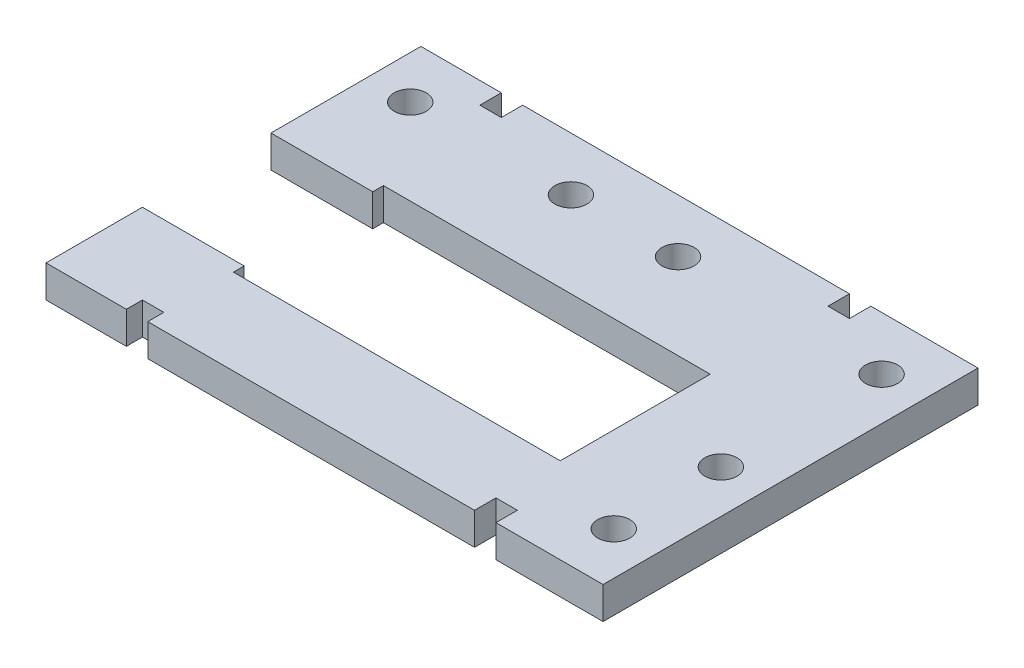
ISO-10303-21;
HEADER;
FILE_DESCRIPTION(('STEP AP214'),'2;1');
FILE_NAME('part.step','',(''),(''),'','','');
FILE_SCHEMA(('AUTOMOTIVE_DESIGN { 1 0 10303 214 1 1 1 1 }'));
ENDSEC;
DATA;
#1=APPLICATION_CONTEXT('core data for automotive mechanical design processes');
#2=APPLICATION_PROTOCOL_DEFINITION('international standard','automotive_design',2000,#1);
#3=PRODUCT_CONTEXT('',#1,'mechanical');
#4=PRODUCT('Part','Part','',(#3));
#5=PRODUCT_RELATED_PRODUCT_CATEGORY('part','',(#4));
#6=PRODUCT_DEFINITION_FORMATION('','',#4);
#7=PRODUCT_DEFINITION_CONTEXT('part definition',#1,'design');
#8=PRODUCT_DEFINITION('design','',#6,#7);
#9=PRODUCT_DEFINITION_SHAPE('','',#8);
#10=(LENGTH_UNIT() NAMED_UNIT(*) SI_UNIT(.MILLI.,.METRE.));
#11=(NAMED_UNIT(*) PLANE_ANGLE_UNIT() SI_UNIT($,.RADIAN.));
#12=(NAMED_UNIT(*) SI_UNIT($,.STERADIAN.) SOLID_ANGLE_UNIT());
#13=UNCERTAINTY_MEASURE_WITH_UNIT(LENGTH_MEASURE(1.E-05),#10,'distance_accuracy_value','');
#14=(GEOMETRIC_REPRESENTATION_CONTEXT(3) GLOBAL_UNCERTAINTY_ASSIGNED_CONTEXT((#13)) GLOBAL_UNIT_ASSIGNED_CONTEXT((#10,
#11,#12)) REPRESENTATION_CONTEXT('',''));
#15=CARTESIAN_POINT('',(0.,0.,0.));
#16=DIRECTION('',(0.,0.,1.));
#17=DIRECTION('',(1.,0.,0.));
#18=AXIS2_PLACEMENT_3D('',#15,#16,#17);
#19=CARTESIAN_POINT('',(0.,3.,-35.));
#20=DIRECTION('',(0.,0.,-1.));
#21=DIRECTION('',(-1.,0.,0.));
#22=AXIS2_PLACEMENT_3D('',#19,#20,#21);
#23=PLANE('',#22);
#24=DIRECTION('',(1.,0.,0.));
#25=VECTOR('',#24,1.);
#26=CARTESIAN_POINT('',(0.,0.,-35.));
#27=LINE('',#26,#25);
#28=CARTESIAN_POINT('',(42.,0.,-35.));
#29=VERTEX_POINT('',#28);
#30=CARTESIAN_POINT('',(52.,0.,-35.));
#31=VERTEX_POINT('',#30);
#32=EDGE_CURVE('E273',#29,#31,#27,.T.);
#33=ORIENTED_EDGE('',*,*,#32,.F.);
#34=DIRECTION('',(0.,-1.,0.));
#35=VECTOR('',#34,1.);
#36=CARTESIAN_POINT('',(42.,3.,-35.));
#37=LINE('',#36,#35);
#38=CARTESIAN_POINT('',(42.,3.,-35.));
#39=VERTEX_POINT('',#38);
#40=EDGE_CURVE('E11',#39,#29,#37,.T.);
#41=ORIENTED_EDGE('',*,*,#40,.F.);
#42=DIRECTION('',(1.,0.,0.));
#43=VECTOR('',#42,1.);
#44=CARTESIAN_POINT('',(0.,3.,-35.));
#45=LINE('',#44,#43);
#46=CARTESIAN_POINT('',(52.,3.,-35.));
#47=VERTEX_POINT('',#46);
#48=EDGE_CURVE('E419',#39,#47,#45,.T.);
#49=ORIENTED_EDGE('',*,*,#48,.T.);
#50=DIRECTION('',(0.,-1.,0.));
#51=VECTOR('',#50,1.);
#52=CARTESIAN_POINT('',(52.,3.,-35.));
#53=LINE('',#52,#51);
#54=EDGE_CURVE('E147',#47,#31,#53,.T.);
#55=ORIENTED_EDGE('',*,*,#54,.T.);
#56=EDGE_LOOP('',(#33,#41,#49,#55));
#57=FACE_BOUND('',#56,.T.);
#58=ADVANCED_FACE('F35',(#57),#23,.T.);
#59=CARTESIAN_POINT('',(42.,3.,0.));
#60=DIRECTION('',(1.,0.,0.));
#61=DIRECTION('',(0.,0.,-1.));
#62=AXIS2_PLACEMENT_3D('',#59,#60,#61);
#63=PLANE('',#62);
#64=DIRECTION('',(0.,0.,1.));
#65=VECTOR('',#64,1.);
#66=CARTESIAN_POINT('',(42.,0.,0.));
#67=LINE('',#66,#65);
#68=CARTESIAN_POINT('',(42.,0.,-33.));
#69=VERTEX_POINT('',#68);
#70=EDGE_CURVE('E275',#29,#69,#67,.T.);
#71=ORIENTED_EDGE('',*,*,#70,.T.);
#72=DIRECTION('',(0.,-1.,0.));
#73=VECTOR('',#72,1.);
#74=CARTESIAN_POINT('',(42.,3.,-33.));
#75=LINE('',#74,#73);
#76=CARTESIAN_POINT('',(42.,3.,-33.));
#77=VERTEX_POINT('',#76);
#78=EDGE_CURVE('E44',#77,#69,#75,.T.);
#79=ORIENTED_EDGE('',*,*,#78,.F.);
#80=DIRECTION('',(0.,0.,1.));
#81=VECTOR('',#80,1.);
#82=CARTESIAN_POINT('',(42.,3.,0.));
#83=LINE('',#82,#81);
#84=EDGE_CURVE('E415',#39,#77,#83,.T.);
#85=ORIENTED_EDGE('',*,*,#84,.F.);
#86=ORIENTED_EDGE('',*,*,#40,.T.);
#87=EDGE_LOOP('',(#71,#79,#85,#86));
#88=FACE_BOUND('',#87,.T.);
#89=ADVANCED_FACE('F402',(#88),#63,.F.);
#90=CARTESIAN_POINT('',(0.,3.,-33.));
#91=DIRECTION('',(0.,0.,-1.));
#92=DIRECTION('',(-1.,0.,0.));
#93=AXIS2_PLACEMENT_3D('',#90,#91,#92);
#94=PLANE('',#93);
#95=DIRECTION('',(1.,0.,0.));
#96=VECTOR('',#95,1.);
#97=CARTESIAN_POINT('',(0.,0.,-33.));
#98=LINE('',#97,#96);
#99=CARTESIAN_POINT('',(40.,0.,-33.));
#100=VERTEX_POINT('',#99);
#101=EDGE_CURVE('E280',#100,#69,#98,.T.);
#102=ORIENTED_EDGE('',*,*,#101,.F.);
#103=DIRECTION('',(0.,-1.,0.));
#104=VECTOR('',#103,1.);
#105=CARTESIAN_POINT('',(40.,3.,-33.));
#106=LINE('',#105,#104);
#107=CARTESIAN_POINT('',(40.,3.,-33.));
#108=VERTEX_POINT('',#107);
#109=EDGE_CURVE('E392',#108,#100,#106,.T.);
#110=ORIENTED_EDGE('',*,*,#109,.F.);
#111=DIRECTION('',(1.,0.,0.));
#112=VECTOR('',#111,1.);
#113=CARTESIAN_POINT('',(0.,3.,-33.));
#114=LINE('',#113,#112);
#115=EDGE_CURVE('E399',#108,#77,#114,.T.);
#116=ORIENTED_EDGE('',*,*,#115,.T.);
#117=ORIENTED_EDGE('',*,*,#78,.T.);
#118=EDGE_LOOP('',(#102,#110,#116,#117));
#119=FACE_BOUND('',#118,.T.);
#120=ADVANCED_FACE('F397',(#119),#94,.T.);
#121=CARTESIAN_POINT('',(40.,3.,0.));
#122=DIRECTION('',(1.,0.,0.));
#123=DIRECTION('',(0.,0.,-1.));
#124=AXIS2_PLACEMENT_3D('',#121,#122,#123);
#125=PLANE('',#124);
#126=DIRECTION('',(0.,0.,1.));
#127=VECTOR('',#126,1.);
#128=CARTESIAN_POINT('',(40.,0.,0.));
#129=LINE('',#128,#127);
#130=CARTESIAN_POINT('',(40.,0.,-35.));
#131=VERTEX_POINT('',#130);
#132=EDGE_CURVE('E283',#131,#100,#129,.T.);
#133=ORIENTED_EDGE('',*,*,#132,.F.);
#134=DIRECTION('',(0.,-1.,0.));
#135=VECTOR('',#134,1.);
#136=CARTESIAN_POINT('',(40.,3.,-35.));
#137=LINE('',#136,#135);
#138=CARTESIAN_POINT('',(40.,3.,-35.));
#139=VERTEX_POINT('',#138);
#140=EDGE_CURVE('E390',#139,#131,#137,.T.);
#141=ORIENTED_EDGE('',*,*,#140,.F.);
#142=DIRECTION('',(0.,0.,1.));
#143=VECTOR('',#142,1.);
#144=CARTESIAN_POINT('',(40.,3.,0.));
#145=LINE('',#144,#143);
#146=EDGE_CURVE('E412',#139,#108,#145,.T.);
#147=ORIENTED_EDGE('',*,*,#146,.T.);
#148=ORIENTED_EDGE('',*,*,#109,.T.);
#149=EDGE_LOOP('',(#133,#141,#147,#148));
#150=FACE_BOUND('',#149,.T.);
#151=ADVANCED_FACE('F409',(#150),#125,.T.);
#152=CARTESIAN_POINT('',(9.5,0.,-35.));
#153=VERTEX_POINT('',#152);
#154=EDGE_CURVE('E277',#153,#131,#27,.T.);
#155=ORIENTED_EDGE('',*,*,#154,.F.);
#156=DIRECTION('',(0.,-1.,0.));
#157=VECTOR('',#156,1.);
#158=CARTESIAN_POINT('',(9.5,3.,-35.));
#159=LINE('',#158,#157);
#160=CARTESIAN_POINT('',(9.5,3.,-35.));
#161=VERTEX_POINT('',#160);
#162=EDGE_CURVE('E388',#161,#153,#159,.T.);
#163=ORIENTED_EDGE('',*,*,#162,.F.);
#164=EDGE_CURVE('E417',#161,#139,#45,.T.);
#165=ORIENTED_EDGE('',*,*,#164,.T.);
#166=ORIENTED_EDGE('',*,*,#140,.T.);
#167=EDGE_LOOP('',(#155,#163,#165,#166));
#168=FACE_BOUND('',#167,.T.);
#169=ADVANCED_FACE('F545',(#168),#23,.T.);
#170=CARTESIAN_POINT('',(9.50000000000003,3.,0.));
#171=DIRECTION('',(1.,0.,0.));
#172=DIRECTION('',(0.,0.,-1.));
#173=AXIS2_PLACEMENT_3D('',#170,#171,#172);
#174=PLANE('',#173);
#175=DIRECTION('',(0.,0.,1.));
#176=VECTOR('',#175,1.);
#177=CARTESIAN_POINT('',(9.50000000000003,0.,0.));
#178=LINE('',#177,#176);
#179=CARTESIAN_POINT('',(9.5,0.,-33.));
#180=VERTEX_POINT('',#179);
#181=EDGE_CURVE('E286',#153,#180,#178,.T.);
#182=ORIENTED_EDGE('',*,*,#181,.T.);
#183=DIRECTION('',(0.,-1.,0.));
#184=VECTOR('',#183,1.);
#185=CARTESIAN_POINT('',(9.5,3.,-33.));
#186=LINE('',#185,#184);
#187=CARTESIAN_POINT('',(9.5,3.,-33.));
#188=VERTEX_POINT('',#187);
#189=EDGE_CURVE('E385',#188,#180,#186,.T.);
#190=ORIENTED_EDGE('',*,*,#189,.F.);
#191=DIRECTION('',(0.,0.,1.));
#192=VECTOR('',#191,1.);
#193=CARTESIAN_POINT('',(9.50000000000003,3.,0.));
#194=LINE('',#193,#192);
#195=EDGE_CURVE('E423',#161,#188,#194,.T.);
#196=ORIENTED_EDGE('',*,*,#195,.F.);
#197=ORIENTED_EDGE('',*,*,#162,.T.);
#198=EDGE_LOOP('',(#182,#190,#196,#197));
#199=FACE_BOUND('',#198,.T.);
#200=ADVANCED_FACE('F543',(#199),#174,.F.);
#201=CARTESIAN_POINT('',(0.,3.,-33.));
#202=DIRECTION('',(0.,0.,1.));
#203=DIRECTION('',(1.,0.,0.));
#204=AXIS2_PLACEMENT_3D('',#201,#202,#203);
#205=PLANE('',#204);
#206=DIRECTION('',(-1.,0.,0.));
#207=VECTOR('',#206,1.);
#208=CARTESIAN_POINT('',(0.,0.,-33.));
#209=LINE('',#208,#207);
#210=CARTESIAN_POINT('',(7.50000000000001,0.,-33.));
#211=VERTEX_POINT('',#210);
#212=EDGE_CURVE('E289',#180,#211,#209,.T.);
#213=ORIENTED_EDGE('',*,*,#212,.T.);
#214=DIRECTION('',(0.,-1.,0.));
#215=VECTOR('',#214,1.);
#216=CARTESIAN_POINT('',(7.50000000000001,3.,-33.));
#217=LINE('',#216,#215);
#218=CARTESIAN_POINT('',(7.50000000000001,3.,-33.));
#219=VERTEX_POINT('',#218);
#220=EDGE_CURVE('E383',#219,#211,#217,.T.);
#221=ORIENTED_EDGE('',*,*,#220,.F.);
#222=DIRECTION('',(-1.,0.,0.));
#223=VECTOR('',#222,1.);
#224=CARTESIAN_POINT('',(0.,3.,-33.));
#225=LINE('',#224,#223);
#226=EDGE_CURVE('E426',#188,#219,#225,.T.);
#227=ORIENTED_EDGE('',*,*,#226,.F.);
#228=ORIENTED_EDGE('',*,*,#189,.T.);
#229=EDGE_LOOP('',(#213,#221,#227,#228));
#230=FACE_BOUND('',#229,.T.);
#231=ADVANCED_FACE('F539',(#230),#205,.F.);
#232=CARTESIAN_POINT('',(7.50000000000002,3.,0.));
#233=DIRECTION('',(1.,0.,0.));
#234=DIRECTION('',(0.,0.,-1.));
#235=AXIS2_PLACEMENT_3D('',#232,#233,#234);
#236=PLANE('',#235);
#237=DIRECTION('',(0.,0.,1.));
#238=VECTOR('',#237,1.);
#239=CARTESIAN_POINT('',(7.50000000000002,0.,0.));
#240=LINE('',#239,#238);
#241=CARTESIAN_POINT('',(7.50000000000001,0.,-35.));
#242=VERTEX_POINT('',#241);
#243=EDGE_CURVE('E292',#242,#211,#240,.T.);
#244=ORIENTED_EDGE('',*,*,#243,.F.);
#245=DIRECTION('',(0.,-1.,0.));
#246=VECTOR('',#245,1.);
#247=CARTESIAN_POINT('',(7.50000000000001,3.,-35.));
#248=LINE('',#247,#246);
#249=CARTESIAN_POINT('',(7.50000000000001,3.,-35.));
#250=VERTEX_POINT('',#249);
#251=EDGE_CURVE('E381',#250,#242,#248,.T.);
#252=ORIENTED_EDGE('',*,*,#251,.F.);
#253=DIRECTION('',(0.,0.,1.));
#254=VECTOR('',#253,1.);
#255=CARTESIAN_POINT('',(7.50000000000002,3.,0.));
#256=LINE('',#255,#254);
#257=EDGE_CURVE('E428',#250,#219,#256,.T.);
#258=ORIENTED_EDGE('',*,*,#257,.T.);
#259=ORIENTED_EDGE('',*,*,#220,.T.);
#260=EDGE_LOOP('',(#244,#252,#258,#259));
#261=FACE_BOUND('',#260,.T.);
#262=ADVANCED_FACE('F535',(#261),#236,.T.);
#263=CARTESIAN_POINT('',(0.,0.,-35.));
#264=VERTEX_POINT('',#263);
#265=EDGE_CURVE('E276',#264,#242,#27,.T.);
#266=ORIENTED_EDGE('',*,*,#265,.F.);
#267=DIRECTION('',(0.,-1.,0.));
#268=VECTOR('',#267,1.);
#269=CARTESIAN_POINT('',(0.,3.,-35.));
#270=LINE('',#269,#268);
#271=CARTESIAN_POINT('',(0.,3.,-35.));
#272=VERTEX_POINT('',#271);
#273=EDGE_CURVE('E379',#272,#264,#270,.T.);
#274=ORIENTED_EDGE('',*,*,#273,.F.);
#275=EDGE_CURVE('E431',#272,#250,#45,.T.);
#276=ORIENTED_EDGE('',*,*,#275,.T.);
#277=ORIENTED_EDGE('',*,*,#251,.T.);
#278=EDGE_LOOP('',(#266,#274,#276,#277));
#279=FACE_BOUND('',#278,.T.);
#280=ADVANCED_FACE('F532',(#279),#23,.T.);
#281=CARTESIAN_POINT('',(0.,3.,0.));
#282=DIRECTION('',(-1.,0.,0.));
#283=DIRECTION('',(0.,0.,1.));
#284=AXIS2_PLACEMENT_3D('',#281,#282,#283);
#285=PLANE('',#284);
#286=DIRECTION('',(0.,0.,-1.));
#287=VECTOR('',#286,1.);
#288=CARTESIAN_POINT('',(0.,0.,0.));
#289=LINE('',#288,#287);
#290=CARTESIAN_POINT('',(0.,0.,-21.));
#291=VERTEX_POINT('',#290);
#292=EDGE_CURVE('E295',#291,#264,#289,.T.);
#293=ORIENTED_EDGE('',*,*,#292,.F.);
#294=DIRECTION('',(0.,-1.,0.));
#295=VECTOR('',#294,1.);
#296=CARTESIAN_POINT('',(0.,3.,-21.));
#297=LINE('',#296,#295);
#298=CARTESIAN_POINT('',(0.,3.,-21.));
#299=VERTEX_POINT('',#298);
#300=EDGE_CURVE('E377',#299,#291,#297,.T.);
#301=ORIENTED_EDGE('',*,*,#300,.F.);
#302=DIRECTION('',(0.,0.,-1.));
#303=VECTOR('',#302,1.);
#304=CARTESIAN_POINT('',(0.,3.,0.));
#305=LINE('',#304,#303);
#306=EDGE_CURVE('E432',#299,#272,#305,.T.);
#307=ORIENTED_EDGE('',*,*,#306,.T.);
#308=ORIENTED_EDGE('',*,*,#273,.T.);
#309=EDGE_LOOP('',(#293,#301,#307,#308));
#310=FACE_BOUND('',#309,.T.);
#311=ADVANCED_FACE('F525',(#310),#285,.T.);
#312=CARTESIAN_POINT('',(0.,3.,-21.));
#313=DIRECTION('',(0.,0.,-1.));
#314=DIRECTION('',(-1.,0.,0.));
#315=AXIS2_PLACEMENT_3D('',#312,#313,#314);
#316=PLANE('',#315);
#317=DIRECTION('',(1.,0.,0.));
#318=VECTOR('',#317,1.);
#319=CARTESIAN_POINT('',(0.,0.,-21.));
#320=LINE('',#319,#318);
#321=CARTESIAN_POINT('',(9.49999999999999,0.,-21.));
#322=VERTEX_POINT('',#321);
#323=EDGE_CURVE('E298',#291,#322,#320,.T.);
#324=ORIENTED_EDGE('',*,*,#323,.T.);
#325=DIRECTION('',(0.,-1.,0.));
#326=VECTOR('',#325,1.);
#327=CARTESIAN_POINT('',(9.49999999999999,3.,-21.));
#328=LINE('',#327,#326);
#329=CARTESIAN_POINT('',(9.49999999999999,3.,-21.));
#330=VERTEX_POINT('',#329);
#331=EDGE_CURVE('E375',#330,#322,#328,.T.);
#332=ORIENTED_EDGE('',*,*,#331,.F.);
#333=DIRECTION('',(1.,0.,0.));
#334=VECTOR('',#333,1.);
#335=CARTESIAN_POINT('',(0.,3.,-21.));
#336=LINE('',#335,#334);
#337=EDGE_CURVE('E435',#299,#330,#336,.T.);
#338=ORIENTED_EDGE('',*,*,#337,.F.);
#339=ORIENTED_EDGE('',*,*,#300,.T.);
#340=EDGE_LOOP('',(#324,#332,#338,#339));
#341=FACE_BOUND('',#340,.T.);
#342=ADVANCED_FACE('F548',(#341),#316,.F.);
#343=CARTESIAN_POINT('',(9.49999999999999,3.,0.));
#344=DIRECTION('',(1.,0.,0.));
#345=DIRECTION('',(0.,0.,-1.));
#346=AXIS2_PLACEMENT_3D('',#343,#344,#345);
#347=PLANE('',#346);
#348=DIRECTION('',(0.,0.,1.));
#349=VECTOR('',#348,1.);
#350=CARTESIAN_POINT('',(9.49999999999999,0.,0.));
#351=LINE('',#350,#349);
#352=CARTESIAN_POINT('',(9.49999999999999,0.,-22.));
#353=VERTEX_POINT('',#352);
#354=EDGE_CURVE('E302',#353,#322,#351,.T.);
#355=ORIENTED_EDGE('',*,*,#354,.F.);
#356=DIRECTION('',(0.,-1.,0.));
#357=VECTOR('',#356,1.);
#358=CARTESIAN_POINT('',(9.49999999999999,3.,-22.));
#359=LINE('',#358,#357);
#360=CARTESIAN_POINT('',(9.49999999999999,3.,-22.));
#361=VERTEX_POINT('',#360);
#362=EDGE_CURVE('E373',#361,#353,#359,.T.);
#363=ORIENTED_EDGE('',*,*,#362,.F.);
#364=DIRECTION('',(0.,0.,1.));
#365=VECTOR('',#364,1.);
#366=CARTESIAN_POINT('',(9.49999999999999,3.,0.));
#367=LINE('',#366,#365);
#368=EDGE_CURVE('E438',#361,#330,#367,.T.);
#369=ORIENTED_EDGE('',*,*,#368,.T.);
#370=ORIENTED_EDGE('',*,*,#331,.T.);
#371=EDGE_LOOP('',(#355,#363,#369,#370));
#372=FACE_BOUND('',#371,.T.);
#373=ADVANCED_FACE('F518',(#372),#347,.T.);
#374=CARTESIAN_POINT('',(0.,3.,-22.));
#375=DIRECTION('',(0.,0.,1.));
#376=DIRECTION('',(1.,0.,0.));
#377=AXIS2_PLACEMENT_3D('',#374,#375,#376);
#378=PLANE('',#377);
#379=DIRECTION('',(-1.,0.,0.));
#380=VECTOR('',#379,1.);
#381=CARTESIAN_POINT('',(0.,0.,-22.));
#382=LINE('',#381,#380);
#383=CARTESIAN_POINT('',(40.,0.,-22.));
#384=VERTEX_POINT('',#383);
#385=EDGE_CURVE('E305',#384,#353,#382,.T.);
#386=ORIENTED_EDGE('',*,*,#385,.F.);
#387=DIRECTION('',(0.,-1.,0.));
#388=VECTOR('',#387,1.);
#389=CARTESIAN_POINT('',(40.,3.,-22.));
#390=LINE('',#389,#388);
#391=CARTESIAN_POINT('',(40.,3.,-22.));
#392=VERTEX_POINT('',#391);
#393=EDGE_CURVE('E371',#392,#384,#390,.T.);
#394=ORIENTED_EDGE('',*,*,#393,.F.);
#395=DIRECTION('',(-1.,0.,0.));
#396=VECTOR('',#395,1.);
#397=CARTESIAN_POINT('',(0.,3.,-22.));
#398=LINE('',#397,#396);
#399=EDGE_CURVE('E441',#392,#361,#398,.T.);
#400=ORIENTED_EDGE('',*,*,#399,.T.);
#401=ORIENTED_EDGE('',*,*,#362,.T.);
#402=EDGE_LOOP('',(#386,#394,#400,#401));
#403=FACE_BOUND('',#402,.T.);
#404=ADVANCED_FACE('F512',(#403),#378,.T.);
#405=CARTESIAN_POINT('',(40.,3.,0.));
#406=DIRECTION('',(1.,0.,0.));
#407=DIRECTION('',(0.,0.,-1.));
#408=AXIS2_PLACEMENT_3D('',#405,#406,#407);
#409=PLANE('',#408);
#410=DIRECTION('',(0.,0.,1.));
#411=VECTOR('',#410,1.);
#412=CARTESIAN_POINT('',(40.,0.,0.));
#413=LINE('',#412,#411);
#414=CARTESIAN_POINT('',(40.,0.,-8.));
#415=VERTEX_POINT('',#414);
#416=EDGE_CURVE('E309',#384,#415,#413,.T.);
#417=ORIENTED_EDGE('',*,*,#416,.T.);
#418=DIRECTION('',(0.,-1.,0.));
#419=VECTOR('',#418,1.);
#420=CARTESIAN_POINT('',(40.,3.,-8.));
#421=LINE('',#420,#419);
#422=CARTESIAN_POINT('',(40.,3.,-8.));
#423=VERTEX_POINT('',#422);
#424=EDGE_CURVE('E368',#423,#415,#421,.T.);
#425=ORIENTED_EDGE('',*,*,#424,.F.);
#426=DIRECTION('',(0.,0.,1.));
#427=VECTOR('',#426,1.);
#428=CARTESIAN_POINT('',(40.,3.,0.));
#429=LINE('',#428,#427);
#430=EDGE_CURVE('E445',#392,#423,#429,.T.);
#431=ORIENTED_EDGE('',*,*,#430,.F.);
#432=ORIENTED_EDGE('',*,*,#393,.T.);
#433=EDGE_LOOP('',(#417,#425,#431,#432));
#434=FACE_BOUND('',#433,.T.);
#435=ADVANCED_FACE('F654',(#434),#409,.F.);
#436=CARTESIAN_POINT('',(0.,3.,-7.99999999999999));
#437=DIRECTION('',(0.,0.,1.));
#438=DIRECTION('',(1.,0.,0.));
#439=AXIS2_PLACEMENT_3D('',#436,#437,#438);
#440=PLANE('',#439);
#441=DIRECTION('',(-1.,0.,0.));
#442=VECTOR('',#441,1.);
#443=CARTESIAN_POINT('',(0.,0.,-7.99999999999999));
#444=LINE('',#443,#442);
#445=CARTESIAN_POINT('',(9.49999999999999,0.,-7.99999999999999));
#446=VERTEX_POINT('',#445);
#447=EDGE_CURVE('E312',#415,#446,#444,.T.);
#448=ORIENTED_EDGE('',*,*,#447,.T.);
#449=DIRECTION('',(0.,-1.,0.));
#450=VECTOR('',#449,1.);
#451=CARTESIAN_POINT('',(9.49999999999999,3.,-7.99999999999999));
#452=LINE('',#451,#450);
#453=CARTESIAN_POINT('',(9.49999999999999,3.,-7.99999999999999));
#454=VERTEX_POINT('',#453);
#455=EDGE_CURVE('E366',#454,#446,#452,.T.);
#456=ORIENTED_EDGE('',*,*,#455,.F.);
#457=DIRECTION('',(-1.,0.,0.));
#458=VECTOR('',#457,1.);
#459=CARTESIAN_POINT('',(0.,3.,-7.99999999999999));
#460=LINE('',#459,#458);
#461=EDGE_CURVE('E448',#423,#454,#460,.T.);
#462=ORIENTED_EDGE('',*,*,#461,.F.);
#463=ORIENTED_EDGE('',*,*,#424,.T.);
#464=EDGE_LOOP('',(#448,#456,#462,#463));
#465=FACE_BOUND('',#464,.T.);
#466=ADVANCED_FACE('F506',(#465),#440,.F.);
#467=CARTESIAN_POINT('',(9.49999999999999,0.,-9.));
#468=VERTEX_POINT('',#467);
#469=EDGE_CURVE('E306',#468,#446,#351,.T.);
#470=ORIENTED_EDGE('',*,*,#469,.F.);
#471=DIRECTION('',(0.,-1.,0.));
#472=VECTOR('',#471,1.);
#473=CARTESIAN_POINT('',(9.49999999999999,3.,-9.));
#474=LINE('',#473,#472);
#475=CARTESIAN_POINT('',(9.49999999999999,3.,-9.));
#476=VERTEX_POINT('',#475);
#477=EDGE_CURVE('E364',#476,#468,#474,.T.);
#478=ORIENTED_EDGE('',*,*,#477,.F.);
#479=EDGE_CURVE('E442',#476,#454,#367,.T.);
#480=ORIENTED_EDGE('',*,*,#479,.T.);
#481=ORIENTED_EDGE('',*,*,#455,.T.);
#482=EDGE_LOOP('',(#470,#478,#480,#481));
#483=FACE_BOUND('',#482,.T.);
#484=ADVANCED_FACE('F503',(#483),#347,.T.);
#485=CARTESIAN_POINT('',(0.,3.,-9.));
#486=DIRECTION('',(0.,0.,-1.));
#487=DIRECTION('',(-1.,0.,0.));
#488=AXIS2_PLACEMENT_3D('',#485,#486,#487);
#489=PLANE('',#488);
#490=DIRECTION('',(1.,0.,0.));
#491=VECTOR('',#490,1.);
#492=CARTESIAN_POINT('',(0.,0.,-9.));
#493=LINE('',#492,#491);
#494=CARTESIAN_POINT('',(0.,0.,-9.));
#495=VERTEX_POINT('',#494);
#496=EDGE_CURVE('E315',#495,#468,#493,.T.);
#497=ORIENTED_EDGE('',*,*,#496,.F.);
#498=DIRECTION('',(0.,-1.,0.));
#499=VECTOR('',#498,1.);
#500=CARTESIAN_POINT('',(0.,3.,-9.));
#501=LINE('',#500,#499);
#502=CARTESIAN_POINT('',(0.,3.,-9.));
#503=VERTEX_POINT('',#502);
#504=EDGE_CURVE('E362',#503,#495,#501,.T.);
#505=ORIENTED_EDGE('',*,*,#504,.F.);
#506=DIRECTION('',(1.,0.,0.));
#507=VECTOR('',#506,1.);
#508=CARTESIAN_POINT('',(0.,3.,-9.));
#509=LINE('',#508,#507);
#510=EDGE_CURVE('E450',#503,#476,#509,.T.);
#511=ORIENTED_EDGE('',*,*,#510,.T.);
#512=ORIENTED_EDGE('',*,*,#477,.T.);
#513=EDGE_LOOP('',(#497,#505,#511,#512));
#514=FACE_BOUND('',#513,.T.);
#515=ADVANCED_FACE('F498',(#514),#489,.T.);
#516=CARTESIAN_POINT('',(0.,0.,0.));
#517=VERTEX_POINT('',#516);
#518=EDGE_CURVE('E299',#517,#495,#289,.T.);
#519=ORIENTED_EDGE('',*,*,#518,.F.);
#520=DIRECTION('',(0.,-1.,0.));
#521=VECTOR('',#520,1.);
#522=CARTESIAN_POINT('',(0.,3.,0.));
#523=LINE('',#522,#521);
#524=CARTESIAN_POINT('',(0.,3.,0.));
#525=VERTEX_POINT('',#524);
#526=EDGE_CURVE('E360',#525,#517,#523,.T.);
#527=ORIENTED_EDGE('',*,*,#526,.F.);
#528=EDGE_CURVE('E436',#525,#503,#305,.T.);
#529=ORIENTED_EDGE('',*,*,#528,.T.);
#530=ORIENTED_EDGE('',*,*,#504,.T.);
#531=EDGE_LOOP('',(#519,#527,#529,#530));
#532=FACE_BOUND('',#531,.T.);
#533=ADVANCED_FACE('F493',(#532),#285,.T.);
#534=CARTESIAN_POINT('',(0.,3.,0.));
#535=DIRECTION('',(0.,0.,-1.));
#536=DIRECTION('',(-1.,0.,0.));
#537=AXIS2_PLACEMENT_3D('',#534,#535,#536);
#538=PLANE('',#537);
#539=DIRECTION('',(1.,0.,0.));
#540=VECTOR('',#539,1.);
#541=CARTESIAN_POINT('',(0.,0.,0.));
#542=LINE('',#541,#540);
#543=CARTESIAN_POINT('',(7.50000000000001,0.,0.));
#544=VERTEX_POINT('',#543);
#545=EDGE_CURVE('E318',#517,#544,#542,.T.);
#546=ORIENTED_EDGE('',*,*,#545,.T.);
#547=DIRECTION('',(0.,-1.,0.));
#548=VECTOR('',#547,1.);
#549=CARTESIAN_POINT('',(7.50000000000001,3.,0.));
#550=LINE('',#549,#548);
#551=CARTESIAN_POINT('',(7.50000000000001,3.,0.));
#552=VERTEX_POINT('',#551);
#553=EDGE_CURVE('E357',#552,#544,#550,.T.);
#554=ORIENTED_EDGE('',*,*,#553,.F.);
#555=DIRECTION('',(1.,0.,0.));
#556=VECTOR('',#555,1.);
#557=CARTESIAN_POINT('',(0.,3.,0.));
#558=LINE('',#557,#556);
#559=EDGE_CURVE('E244',#525,#552,#558,.T.);
#560=ORIENTED_EDGE('',*,*,#559,.F.);
#561=ORIENTED_EDGE('',*,*,#526,.T.);
#562=EDGE_LOOP('',(#546,#554,#560,#561));
#563=FACE_BOUND('',#562,.T.);
#564=ADVANCED_FACE('F489',(#563),#538,.F.);
#565=CARTESIAN_POINT('',(7.50000000000001,3.,0.));
#566=DIRECTION('',(-1.,0.,0.));
#567=DIRECTION('',(0.,0.,1.));
#568=AXIS2_PLACEMENT_3D('',#565,#566,#567);
#569=PLANE('',#568);
#570=DIRECTION('',(0.,0.,-1.));
#571=VECTOR('',#570,1.);
#572=CARTESIAN_POINT('',(7.50000000000001,0.,0.));
#573=LINE('',#572,#571);
#574=CARTESIAN_POINT('',(7.50000000000001,0.,-1.5));
#575=VERTEX_POINT('',#574);
#576=EDGE_CURVE('E321',#544,#575,#573,.T.);
#577=ORIENTED_EDGE('',*,*,#576,.T.);
#578=DIRECTION('',(0.,-1.,0.));
#579=VECTOR('',#578,1.);
#580=CARTESIAN_POINT('',(7.50000000000001,3.,-1.5));
#581=LINE('',#580,#579);
#582=CARTESIAN_POINT('',(7.50000000000001,3.,-1.5));
#583=VERTEX_POINT('',#582);
#584=EDGE_CURVE('E354',#583,#575,#581,.T.);
#585=ORIENTED_EDGE('',*,*,#584,.F.);
#586=DIRECTION('',(0.,0.,-1.));
#587=VECTOR('',#586,1.);
#588=CARTESIAN_POINT('',(7.50000000000001,3.,0.));
#589=LINE('',#588,#587);
#590=EDGE_CURVE('E454',#552,#583,#589,.T.);
#591=ORIENTED_EDGE('',*,*,#590,.F.);
#592=ORIENTED_EDGE('',*,*,#553,.T.);
#593=EDGE_LOOP('',(#577,#585,#591,#592));
#594=FACE_BOUND('',#593,.T.);
#595=ADVANCED_FACE('F486',(#594),#569,.F.);
#596=CARTESIAN_POINT('',(0.,3.,-1.5));
#597=DIRECTION('',(0.,0.,-1.));
#598=DIRECTION('',(-1.,0.,0.));
#599=AXIS2_PLACEMENT_3D('',#596,#597,#598);
#600=PLANE('',#599);
#601=DIRECTION('',(1.,0.,0.));
#602=VECTOR('',#601,1.);
#603=CARTESIAN_POINT('',(0.,0.,-1.5));
#604=LINE('',#603,#602);
#605=CARTESIAN_POINT('',(9.50000000000001,0.,-1.5));
#606=VERTEX_POINT('',#605);
#607=EDGE_CURVE('E326',#575,#606,#604,.T.);
#608=ORIENTED_EDGE('',*,*,#607,.T.);
#609=DIRECTION('',(0.,-1.,0.));
#610=VECTOR('',#609,1.);
#611=CARTESIAN_POINT('',(9.50000000000001,3.,-1.5));
#612=LINE('',#611,#610);
#613=CARTESIAN_POINT('',(9.50000000000001,3.,-1.5));
#614=VERTEX_POINT('',#613);
#615=EDGE_CURVE('E352',#614,#606,#612,.T.);
#616=ORIENTED_EDGE('',*,*,#615,.F.);
#617=DIRECTION('',(1.,0.,0.));
#618=VECTOR('',#617,1.);
#619=CARTESIAN_POINT('',(0.,3.,-1.5));
#620=LINE('',#619,#618);
#621=EDGE_CURVE('E457',#583,#614,#620,.T.);
#622=ORIENTED_EDGE('',*,*,#621,.F.);
#623=ORIENTED_EDGE('',*,*,#584,.T.);
#624=EDGE_LOOP('',(#608,#616,#622,#623));
#625=FACE_BOUND('',#624,.T.);
#626=ADVANCED_FACE('F479',(#625),#600,.F.);
#627=CARTESIAN_POINT('',(9.50000000000001,3.,0.));
#628=DIRECTION('',(-1.,0.,0.));
#629=DIRECTION('',(0.,0.,1.));
#630=AXIS2_PLACEMENT_3D('',#627,#628,#629);
#631=PLANE('',#630);
#632=DIRECTION('',(0.,0.,-1.));
#633=VECTOR('',#632,1.);
#634=CARTESIAN_POINT('',(9.50000000000001,0.,0.));
#635=LINE('',#634,#633);
#636=CARTESIAN_POINT('',(9.50000000000001,0.,0.));
#637=VERTEX_POINT('',#636);
#638=EDGE_CURVE('E329',#637,#606,#635,.T.);
#639=ORIENTED_EDGE('',*,*,#638,.F.);
#640=DIRECTION('',(0.,-1.,0.));
#641=VECTOR('',#640,1.);
#642=CARTESIAN_POINT('',(9.50000000000001,3.,0.));
#643=LINE('',#642,#641);
#644=CARTESIAN_POINT('',(9.50000000000001,3.,0.));
#645=VERTEX_POINT('',#644);
#646=EDGE_CURVE('E350',#645,#637,#643,.T.);
#647=ORIENTED_EDGE('',*,*,#646,.F.);
#648=DIRECTION('',(0.,0.,-1.));
#649=VECTOR('',#648,1.);
#650=CARTESIAN_POINT('',(9.50000000000001,3.,0.));
#651=LINE('',#650,#649);
#652=EDGE_CURVE('E459',#645,#614,#651,.T.);
#653=ORIENTED_EDGE('',*,*,#652,.T.);
#654=ORIENTED_EDGE('',*,*,#615,.T.);
#655=EDGE_LOOP('',(#639,#647,#653,#654));
#656=FACE_BOUND('',#655,.T.);
#657=ADVANCED_FACE('F476',(#656),#631,.T.);
#658=CARTESIAN_POINT('',(40.,0.,0.));
#659=VERTEX_POINT('',#658);
#660=EDGE_CURVE('E323',#637,#659,#542,.T.);
#661=ORIENTED_EDGE('',*,*,#660,.T.);
#662=DIRECTION('',(0.,-1.,0.));
#663=VECTOR('',#662,1.);
#664=CARTESIAN_POINT('',(40.,3.,0.));
#665=LINE('',#664,#663);
#666=CARTESIAN_POINT('',(40.,3.,0.));
#667=VERTEX_POINT('',#666);
#668=EDGE_CURVE('E347',#667,#659,#665,.T.);
#669=ORIENTED_EDGE('',*,*,#668,.F.);
#670=EDGE_CURVE('E243',#645,#667,#558,.T.);
#671=ORIENTED_EDGE('',*,*,#670,.F.);
#672=ORIENTED_EDGE('',*,*,#646,.T.);
#673=EDGE_LOOP('',(#661,#669,#671,#672));
#674=FACE_BOUND('',#673,.T.);
#675=ADVANCED_FACE('F468',(#674),#538,.F.);
#676=CARTESIAN_POINT('',(40.,3.,0.));
#677=DIRECTION('',(-1.,0.,0.));
#678=DIRECTION('',(0.,0.,1.));
#679=AXIS2_PLACEMENT_3D('',#676,#677,#678);
#680=PLANE('',#679);
#681=DIRECTION('',(0.,0.,-1.));
#682=VECTOR('',#681,1.);
#683=CARTESIAN_POINT('',(40.,0.,0.));
#684=LINE('',#683,#682);
#685=CARTESIAN_POINT('',(40.,0.,-2.));
#686=VERTEX_POINT('',#685);
#687=EDGE_CURVE('E332',#659,#686,#684,.T.);
#688=ORIENTED_EDGE('',*,*,#687,.T.);
#689=DIRECTION('',(0.,-1.,0.));
#690=VECTOR('',#689,1.);
#691=CARTESIAN_POINT('',(40.,3.,-2.));
#692=LINE('',#691,#690);
#693=CARTESIAN_POINT('',(40.,3.,-2.));
#694=VERTEX_POINT('',#693);
#695=EDGE_CURVE('E344',#694,#686,#692,.T.);
#696=ORIENTED_EDGE('',*,*,#695,.F.);
#697=DIRECTION('',(0.,0.,-1.));
#698=VECTOR('',#697,1.);
#699=CARTESIAN_POINT('',(40.,3.,0.));
#700=LINE('',#699,#698);
#701=EDGE_CURVE('E250',#667,#694,#700,.T.);
#702=ORIENTED_EDGE('',*,*,#701,.F.);
#703=ORIENTED_EDGE('',*,*,#668,.T.);
#704=EDGE_LOOP('',(#688,#696,#702,#703));
#705=FACE_BOUND('',#704,.T.);
#706=ADVANCED_FACE('F471',(#705),#680,.F.);
#707=CARTESIAN_POINT('',(0.,3.,-2.));
#708=DIRECTION('',(0.,0.,-1.));
#709=DIRECTION('',(-1.,0.,0.));
#710=AXIS2_PLACEMENT_3D('',#707,#708,#709);
#711=PLANE('',#710);
#712=DIRECTION('',(1.,0.,0.));
#713=VECTOR('',#712,1.);
#714=CARTESIAN_POINT('',(0.,0.,-2.));
#715=LINE('',#714,#713);
#716=CARTESIAN_POINT('',(42.,0.,-2.));
#717=VERTEX_POINT('',#716);
#718=EDGE_CURVE('E335',#686,#717,#715,.T.);
#719=ORIENTED_EDGE('',*,*,#718,.T.);
#720=DIRECTION('',(0.,-1.,0.));
#721=VECTOR('',#720,1.);
#722=CARTESIAN_POINT('',(42.,3.,-2.));
#723=LINE('',#722,#721);
#724=CARTESIAN_POINT('',(42.,3.,-2.));
#725=VERTEX_POINT('',#724);
#726=EDGE_CURVE('E236',#725,#717,#723,.T.);
#727=ORIENTED_EDGE('',*,*,#726,.F.);
#728=DIRECTION('',(1.,0.,0.));
#729=VECTOR('',#728,1.);
#730=CARTESIAN_POINT('',(0.,3.,-2.));
#731=LINE('',#730,#729);
#732=EDGE_CURVE('E247',#694,#725,#731,.T.);
#733=ORIENTED_EDGE('',*,*,#732,.F.);
#734=ORIENTED_EDGE('',*,*,#695,.T.);
#735=EDGE_LOOP('',(#719,#727,#733,#734));
#736=FACE_BOUND('',#735,.T.);
#737=ADVANCED_FACE('F473',(#736),#711,.F.);
#738=CARTESIAN_POINT('',(42.,3.,0.));
#739=DIRECTION('',(-1.,0.,0.));
#740=DIRECTION('',(0.,0.,1.));
#741=AXIS2_PLACEMENT_3D('',#738,#739,#740);
#742=PLANE('',#741);
#743=DIRECTION('',(0.,0.,-1.));
#744=VECTOR('',#743,1.);
#745=CARTESIAN_POINT('',(42.,0.,0.));
#746=LINE('',#745,#744);
#747=CARTESIAN_POINT('',(42.,0.,0.));
#748=VERTEX_POINT('',#747);
#749=EDGE_CURVE('E233',#748,#717,#746,.T.);
#750=ORIENTED_EDGE('',*,*,#749,.F.);
#751=DIRECTION('',(0.,-1.,0.));
#752=VECTOR('',#751,1.);
#753=CARTESIAN_POINT('',(42.,3.,0.));
#754=LINE('',#753,#752);
#755=CARTESIAN_POINT('',(42.,3.,0.));
#756=VERTEX_POINT('',#755);
#757=EDGE_CURVE('E227',#756,#748,#754,.T.);
#758=ORIENTED_EDGE('',*,*,#757,.F.);
#759=DIRECTION('',(0.,0.,-1.));
#760=VECTOR('',#759,1.);
#761=CARTESIAN_POINT('',(42.,3.,0.));
#762=LINE('',#761,#760);
#763=EDGE_CURVE('E231',#756,#725,#762,.T.);
#764=ORIENTED_EDGE('',*,*,#763,.T.);
#765=ORIENTED_EDGE('',*,*,#726,.T.);
#766=EDGE_LOOP('',(#750,#758,#764,#765));
#767=FACE_BOUND('',#766,.T.);
#768=ADVANCED_FACE('F229',(#767),#742,.T.);
#769=CARTESIAN_POINT('',(52.,0.,0.));
#770=VERTEX_POINT('',#769);
#771=EDGE_CURVE('E322',#748,#770,#542,.T.);
#772=ORIENTED_EDGE('',*,*,#771,.T.);
#773=DIRECTION('',(0.,-1.,0.));
#774=VECTOR('',#773,1.);
#775=CARTESIAN_POINT('',(52.,3.,0.));
#776=LINE('',#775,#774);
#777=CARTESIAN_POINT('',(52.,3.,0.));
#778=VERTEX_POINT('',#777);
#779=EDGE_CURVE('E237',#778,#770,#776,.T.);
#780=ORIENTED_EDGE('',*,*,#779,.F.);
#781=EDGE_CURVE('E240',#756,#778,#558,.T.);
#782=ORIENTED_EDGE('',*,*,#781,.F.);
#783=ORIENTED_EDGE('',*,*,#757,.T.);
#784=EDGE_LOOP('',(#772,#780,#782,#783));
#785=FACE_BOUND('',#784,.T.);
#786=ADVANCED_FACE('F241',(#785),#538,.F.);
#787=CARTESIAN_POINT('',(4.,3.,-30.));
#788=DIRECTION('',(0.,-1.,0.));
#789=DIRECTION('',(0.,0.,-1.));
#790=AXIS2_PLACEMENT_3D('',#787,#788,#789);
#791=CYLINDRICAL_SURFACE('',#790,1.5);
#792=CARTESIAN_POINT('',(4.,3.,-30.));
#793=DIRECTION('',(0.,1.,0.));
#794=DIRECTION('',(0.,0.,1.));
#795=AXIS2_PLACEMENT_3D('',#792,#793,#794);
#796=CIRCLE('',#795,1.5);
#797=CARTESIAN_POINT('',(4.,3.,-28.5));
#798=VERTEX_POINT('',#797);
#799=EDGE_CURVE('E547',#798,#798,#796,.T.);
#800=ORIENTED_EDGE('',*,*,#799,.T.);
#801=EDGE_LOOP('',(#800));
#802=FACE_BOUND('',#801,.T.);
#803=CARTESIAN_POINT('',(4.,0.,-30.));
#804=DIRECTION('',(0.,1.,0.));
#805=DIRECTION('',(0.,0.,1.));
#806=AXIS2_PLACEMENT_3D('',#803,#804,#805);
#807=CIRCLE('',#806,1.5);
#808=CARTESIAN_POINT('',(4.,0.,-28.5));
#809=VERTEX_POINT('',#808);
#810=EDGE_CURVE('E270',#809,#809,#807,.T.);
#811=ORIENTED_EDGE('',*,*,#810,.F.);
#812=EDGE_LOOP('',(#811));
#813=FACE_BOUND('',#812,.T.);
#814=ADVANCED_FACE('F581',(#802,#813),#791,.F.);
#815=CARTESIAN_POINT('',(48.,3.,-30.));
#816=DIRECTION('',(0.,-1.,0.));
#817=DIRECTION('',(0.,0.,-1.));
#818=AXIS2_PLACEMENT_3D('',#815,#816,#817);
#819=CYLINDRICAL_SURFACE('',#818,1.5);
#820=CARTESIAN_POINT('',(48.,3.,-30.));
#821=DIRECTION('',(0.,1.,0.));
#822=DIRECTION('',(0.,0.,1.));
#823=AXIS2_PLACEMENT_3D('',#820,#821,#822);
#824=CIRCLE('',#823,1.5);
#825=CARTESIAN_POINT('',(48.,3.,-28.5));
#826=VERTEX_POINT('',#825);
#827=EDGE_CURVE('E880',#826,#826,#824,.T.);
#828=ORIENTED_EDGE('',*,*,#827,.T.);
#829=EDGE_LOOP('',(#828));
#830=FACE_BOUND('',#829,.T.);
#831=CARTESIAN_POINT('',(48.,0.,-30.));
#832=DIRECTION('',(0.,1.,0.));
#833=DIRECTION('',(0.,0.,1.));
#834=AXIS2_PLACEMENT_3D('',#831,#832,#833);
#835=CIRCLE('',#834,1.5);
#836=CARTESIAN_POINT('',(48.,0.,-28.5));
#837=VERTEX_POINT('',#836);
#838=EDGE_CURVE('E267',#837,#837,#835,.T.);
#839=ORIENTED_EDGE('',*,*,#838,.F.);
#840=EDGE_LOOP('',(#839));
#841=FACE_BOUND('',#840,.T.);
#842=ADVANCED_FACE('F584',(#830,#841),#819,.F.);
#843=CARTESIAN_POINT('',(19.,3.,-30.));
#844=DIRECTION('',(0.,-1.,0.));
#845=DIRECTION('',(0.,0.,-1.));
#846=AXIS2_PLACEMENT_3D('',#843,#844,#845);
#847=CYLINDRICAL_SURFACE('',#846,1.5);
#848=CARTESIAN_POINT('',(19.,3.,-30.));
#849=DIRECTION('',(0.,1.,0.));
#850=DIRECTION('',(0.,0.,1.));
#851=AXIS2_PLACEMENT_3D('',#848,#849,#850);
#852=CIRCLE('',#851,1.5);
#853=CARTESIAN_POINT('',(19.,3.,-28.5));
#854=VERTEX_POINT('',#853);
#855=EDGE_CURVE('E876',#854,#854,#852,.T.);
#856=ORIENTED_EDGE('',*,*,#855,.T.);
#857=EDGE_LOOP('',(#856));
#858=FACE_BOUND('',#857,.T.);
#859=CARTESIAN_POINT('',(19.,0.,-30.));
#860=DIRECTION('',(0.,1.,0.));
#861=DIRECTION('',(0.,0.,1.));
#862=AXIS2_PLACEMENT_3D('',#859,#860,#861);
#863=CIRCLE('',#862,1.5);
#864=CARTESIAN_POINT('',(19.,0.,-28.5));
#865=VERTEX_POINT('',#864);
#866=EDGE_CURVE('E264',#865,#865,#863,.T.);
#867=ORIENTED_EDGE('',*,*,#866,.F.);
#868=EDGE_LOOP('',(#867));
#869=FACE_BOUND('',#868,.T.);
#870=ADVANCED_FACE('F588',(#858,#869),#847,.F.);
#871=CARTESIAN_POINT('',(29.,3.,-30.));
#872=DIRECTION('',(0.,-1.,0.));
#873=DIRECTION('',(0.,0.,-1.));
#874=AXIS2_PLACEMENT_3D('',#871,#872,#873);
#875=CYLINDRICAL_SURFACE('',#874,1.5);
#876=CARTESIAN_POINT('',(29.,3.,-30.));
#877=DIRECTION('',(0.,1.,0.));
#878=DIRECTION('',(0.,0.,1.));
#879=AXIS2_PLACEMENT_3D('',#876,#877,#878);
#880=CIRCLE('',#879,1.5);
#881=CARTESIAN_POINT('',(29.,3.,-28.5));
#882=VERTEX_POINT('',#881);
#883=EDGE_CURVE('E872',#882,#882,#880,.T.);
#884=ORIENTED_EDGE('',*,*,#883,.T.);
#885=EDGE_LOOP('',(#884));
#886=FACE_BOUND('',#885,.T.);
#887=CARTESIAN_POINT('',(29.,0.,-30.));
#888=DIRECTION('',(0.,1.,0.));
#889=DIRECTION('',(0.,0.,1.));
#890=AXIS2_PLACEMENT_3D('',#887,#888,#889);
#891=CIRCLE('',#890,1.5);
#892=CARTESIAN_POINT('',(29.,0.,-28.5));
#893=VERTEX_POINT('',#892);
#894=EDGE_CURVE('E261',#893,#893,#891,.T.);
#895=ORIENTED_EDGE('',*,*,#894,.F.);
#896=EDGE_LOOP('',(#895));
#897=FACE_BOUND('',#896,.T.);
#898=ADVANCED_FACE('F592',(#886,#897),#875,.F.);
#899=CARTESIAN_POINT('',(48.,3.,-15.));
#900=DIRECTION('',(0.,-1.,0.));
#901=DIRECTION('',(0.,0.,-1.));
#902=AXIS2_PLACEMENT_3D('',#899,#900,#901);
#903=CYLINDRICAL_SURFACE('',#902,1.5);
#904=CARTESIAN_POINT('',(48.,3.,-15.));
#905=DIRECTION('',(0.,1.,0.));
#906=DIRECTION('',(0.,0.,1.));
#907=AXIS2_PLACEMENT_3D('',#904,#905,#906);
#908=CIRCLE('',#907,1.5);
#909=CARTESIAN_POINT('',(48.,3.,-13.5));
#910=VERTEX_POINT('',#909);
#911=EDGE_CURVE('E607',#910,#910,#908,.T.);
#912=ORIENTED_EDGE('',*,*,#911,.T.);
#913=EDGE_LOOP('',(#912));
#914=FACE_BOUND('',#913,.T.);
#915=CARTESIAN_POINT('',(48.,0.,-15.));
#916=DIRECTION('',(0.,1.,0.));
#917=DIRECTION('',(0.,0.,1.));
#918=AXIS2_PLACEMENT_3D('',#915,#916,#917);
#919=CIRCLE('',#918,1.5);
#920=CARTESIAN_POINT('',(48.,0.,-13.5));
#921=VERTEX_POINT('',#920);
#922=EDGE_CURVE('E258',#921,#921,#919,.T.);
#923=ORIENTED_EDGE('',*,*,#922,.F.);
#924=EDGE_LOOP('',(#923));
#925=FACE_BOUND('',#924,.T.);
#926=ADVANCED_FACE('F595',(#914,#925),#903,.F.);
#927=CARTESIAN_POINT('',(48.,3.,-5.));
#928=DIRECTION('',(0.,-1.,0.));
#929=DIRECTION('',(0.,0.,-1.));
#930=AXIS2_PLACEMENT_3D('',#927,#928,#929);
#931=CYLINDRICAL_SURFACE('',#930,1.5);
#932=CARTESIAN_POINT('',(48.,3.,-5.));
#933=DIRECTION('',(0.,1.,0.));
#934=DIRECTION('',(0.,0.,1.));
#935=AXIS2_PLACEMENT_3D('',#932,#933,#934);
#936=CIRCLE('',#935,1.5);
#937=CARTESIAN_POINT('',(48.,3.,-3.5));
#938=VERTEX_POINT('',#937);
#939=EDGE_CURVE('E340',#938,#938,#936,.T.);
#940=ORIENTED_EDGE('',*,*,#939,.T.);
#941=EDGE_LOOP('',(#940));
#942=FACE_BOUND('',#941,.T.);
#943=CARTESIAN_POINT('',(48.,0.,-5.));
#944=DIRECTION('',(0.,1.,0.));
#945=DIRECTION('',(0.,0.,1.));
#946=AXIS2_PLACEMENT_3D('',#943,#944,#945);
#947=CIRCLE('',#946,1.5);
#948=CARTESIAN_POINT('',(48.,0.,-3.5));
#949=VERTEX_POINT('',#948);
#950=EDGE_CURVE('E255',#949,#949,#947,.T.);
#951=ORIENTED_EDGE('',*,*,#950,.F.);
#952=EDGE_LOOP('',(#951));
#953=FACE_BOUND('',#952,.T.);
#954=ADVANCED_FACE('F37',(#942,#953),#931,.F.);
#955=CARTESIAN_POINT('',(52.,3.,0.));
#956=DIRECTION('',(-1.,0.,0.));
#957=DIRECTION('',(0.,0.,1.));
#958=AXIS2_PLACEMENT_3D('',#955,#956,#957);
#959=PLANE('',#958);
#960=DIRECTION('',(0.,0.,-1.));
#961=VECTOR('',#960,1.);
#962=CARTESIAN_POINT('',(52.,0.,0.));
#963=LINE('',#962,#961);
#964=EDGE_CURVE('E140',#770,#31,#963,.T.);
#965=ORIENTED_EDGE('',*,*,#964,.T.);
#966=ORIENTED_EDGE('',*,*,#54,.F.);
#967=DIRECTION('',(0.,0.,-1.));
#968=VECTOR('',#967,1.);
#969=CARTESIAN_POINT('',(52.,3.,0.));
#970=LINE('',#969,#968);
#971=EDGE_CURVE('E52',#778,#47,#970,.T.);
#972=ORIENTED_EDGE('',*,*,#971,.F.);
#973=ORIENTED_EDGE('',*,*,#779,.T.);
#974=EDGE_LOOP('',(#965,#966,#972,#973));
#975=FACE_BOUND('',#974,.T.);
#976=ADVANCED_FACE('F602',(#975),#959,.F.);
#977=CARTESIAN_POINT('',(0.,3.,0.));
#978=DIRECTION('',(0.,1.,0.));
#979=DIRECTION('',(0.,0.,1.));
#980=AXIS2_PLACEMENT_3D('',#977,#978,#979);
#981=PLANE('',#980);
#982=ORIENTED_EDGE('',*,*,#939,.F.);
#983=EDGE_LOOP('',(#982));
#984=FACE_BOUND('',#983,.T.);
#985=ORIENTED_EDGE('',*,*,#911,.F.);
#986=EDGE_LOOP('',(#985));
#987=FACE_BOUND('',#986,.T.);
#988=ORIENTED_EDGE('',*,*,#883,.F.);
#989=EDGE_LOOP('',(#988));
#990=FACE_BOUND('',#989,.T.);
#991=ORIENTED_EDGE('',*,*,#855,.F.);
#992=EDGE_LOOP('',(#991));
#993=FACE_BOUND('',#992,.T.);
#994=ORIENTED_EDGE('',*,*,#827,.F.);
#995=EDGE_LOOP('',(#994));
#996=FACE_BOUND('',#995,.T.);
#997=ORIENTED_EDGE('',*,*,#799,.F.);
#998=EDGE_LOOP('',(#997));
#999=FACE_BOUND('',#998,.T.);
#1000=ORIENTED_EDGE('',*,*,#48,.F.);
#1001=ORIENTED_EDGE('',*,*,#84,.T.);
#1002=ORIENTED_EDGE('',*,*,#115,.F.);
#1003=ORIENTED_EDGE('',*,*,#146,.F.);
#1004=ORIENTED_EDGE('',*,*,#164,.F.);
#1005=ORIENTED_EDGE('',*,*,#195,.T.);
#1006=ORIENTED_EDGE('',*,*,#226,.T.);
#1007=ORIENTED_EDGE('',*,*,#257,.F.);
#1008=ORIENTED_EDGE('',*,*,#275,.F.);
#1009=ORIENTED_EDGE('',*,*,#306,.F.);
#1010=ORIENTED_EDGE('',*,*,#337,.T.);
#1011=ORIENTED_EDGE('',*,*,#368,.F.);
#1012=ORIENTED_EDGE('',*,*,#399,.F.);
#1013=ORIENTED_EDGE('',*,*,#430,.T.);
#1014=ORIENTED_EDGE('',*,*,#461,.T.);
#1015=ORIENTED_EDGE('',*,*,#479,.F.);
#1016=ORIENTED_EDGE('',*,*,#510,.F.);
#1017=ORIENTED_EDGE('',*,*,#528,.F.);
#1018=ORIENTED_EDGE('',*,*,#559,.T.);
#1019=ORIENTED_EDGE('',*,*,#590,.T.);
#1020=ORIENTED_EDGE('',*,*,#621,.T.);
#1021=ORIENTED_EDGE('',*,*,#652,.F.);
#1022=ORIENTED_EDGE('',*,*,#670,.T.);
#1023=ORIENTED_EDGE('',*,*,#701,.T.);
#1024=ORIENTED_EDGE('',*,*,#732,.T.);
#1025=ORIENTED_EDGE('',*,*,#763,.F.);
#1026=ORIENTED_EDGE('',*,*,#781,.T.);
#1027=ORIENTED_EDGE('',*,*,#971,.T.);
#1028=EDGE_LOOP('',(#1000,#1001,#1002,#1003,#1004,#1005,#1006,#1007,#1008,#1009,#1010,#1011,
#1012,#1013,#1014,#1015,#1016,#1017,#1018,#1019,#1020,#1021,#1022,#1023,#1024,#1025,#1026,#1027));
#1029=FACE_BOUND('',#1028,.T.);
#1030=ADVANCED_FACE('F245',(#984,#987,#990,#993,#996,#999,#1029),#981,.T.);
#1031=CARTESIAN_POINT('',(0.,0.,0.));
#1032=DIRECTION('',(0.,1.,0.));
#1033=DIRECTION('',(0.,0.,1.));
#1034=AXIS2_PLACEMENT_3D('',#1031,#1032,#1033);
#1035=PLANE('',#1034);
#1036=ORIENTED_EDGE('',*,*,#950,.T.);
#1037=EDGE_LOOP('',(#1036));
#1038=FACE_BOUND('',#1037,.T.);
#1039=ORIENTED_EDGE('',*,*,#922,.T.);
#1040=EDGE_LOOP('',(#1039));
#1041=FACE_BOUND('',#1040,.T.);
#1042=ORIENTED_EDGE('',*,*,#894,.T.);
#1043=EDGE_LOOP('',(#1042));
#1044=FACE_BOUND('',#1043,.T.);
#1045=ORIENTED_EDGE('',*,*,#866,.T.);
#1046=EDGE_LOOP('',(#1045));
#1047=FACE_BOUND('',#1046,.T.);
#1048=ORIENTED_EDGE('',*,*,#838,.T.);
#1049=EDGE_LOOP('',(#1048));
#1050=FACE_BOUND('',#1049,.T.);
#1051=ORIENTED_EDGE('',*,*,#810,.T.);
#1052=EDGE_LOOP('',(#1051));
#1053=FACE_BOUND('',#1052,.T.);
#1054=ORIENTED_EDGE('',*,*,#32,.T.);
#1055=ORIENTED_EDGE('',*,*,#964,.F.);
#1056=ORIENTED_EDGE('',*,*,#771,.F.);
#1057=ORIENTED_EDGE('',*,*,#749,.T.);
#1058=ORIENTED_EDGE('',*,*,#718,.F.);
#1059=ORIENTED_EDGE('',*,*,#687,.F.);
#1060=ORIENTED_EDGE('',*,*,#660,.F.);
#1061=ORIENTED_EDGE('',*,*,#638,.T.);
#1062=ORIENTED_EDGE('',*,*,#607,.F.);
#1063=ORIENTED_EDGE('',*,*,#576,.F.);
#1064=ORIENTED_EDGE('',*,*,#545,.F.);
#1065=ORIENTED_EDGE('',*,*,#518,.T.);
#1066=ORIENTED_EDGE('',*,*,#496,.T.);
#1067=ORIENTED_EDGE('',*,*,#469,.T.);
#1068=ORIENTED_EDGE('',*,*,#447,.F.);
#1069=ORIENTED_EDGE('',*,*,#416,.F.);
#1070=ORIENTED_EDGE('',*,*,#385,.T.);
#1071=ORIENTED_EDGE('',*,*,#354,.T.);
#1072=ORIENTED_EDGE('',*,*,#323,.F.);
#1073=ORIENTED_EDGE('',*,*,#292,.T.);
#1074=ORIENTED_EDGE('',*,*,#265,.T.);
#1075=ORIENTED_EDGE('',*,*,#243,.T.);
#1076=ORIENTED_EDGE('',*,*,#212,.F.);
#1077=ORIENTED_EDGE('',*,*,#181,.F.);
#1078=ORIENTED_EDGE('',*,*,#154,.T.);
#1079=ORIENTED_EDGE('',*,*,#132,.T.);
#1080=ORIENTED_EDGE('',*,*,#101,.T.);
#1081=ORIENTED_EDGE('',*,*,#70,.F.);
#1082=EDGE_LOOP('',(#1054,#1055,#1056,#1057,#1058,#1059,#1060,#1061,#1062,#1063,#1064,#1065,
#1066,#1067,#1068,#1069,#1070,#1071,#1072,#1073,#1074,#1075,#1076,#1077,#1078,#1079,#1080,#1081));
#1083=FACE_BOUND('',#1082,.T.);
#1084=ADVANCED_FACE('F403',(#1038,#1041,#1044,#1047,#1050,#1053,#1083),#1035,.F.);
#1085=CLOSED_SHELL('',(#58,#89,#120,#151,#169,#200,#231,#262,#280,#311,#342,#373,#404,#435,#466,
#484,#515,#533,#564,#595,#626,#657,#675,#706,#737,#768,#786,#814,#842,#870,#898,#926,#954,#976,
#1030,#1084));
#1086=MANIFOLD_SOLID_BREP('B2',#1085);
#1087=ADVANCED_BREP_SHAPE_REPRESENTATION('',(#18,#1086),#14);
#1088=SHAPE_DEFINITION_REPRESENTATION(#9,#1087);
ENDSEC;
END-ISO-10303-21;
